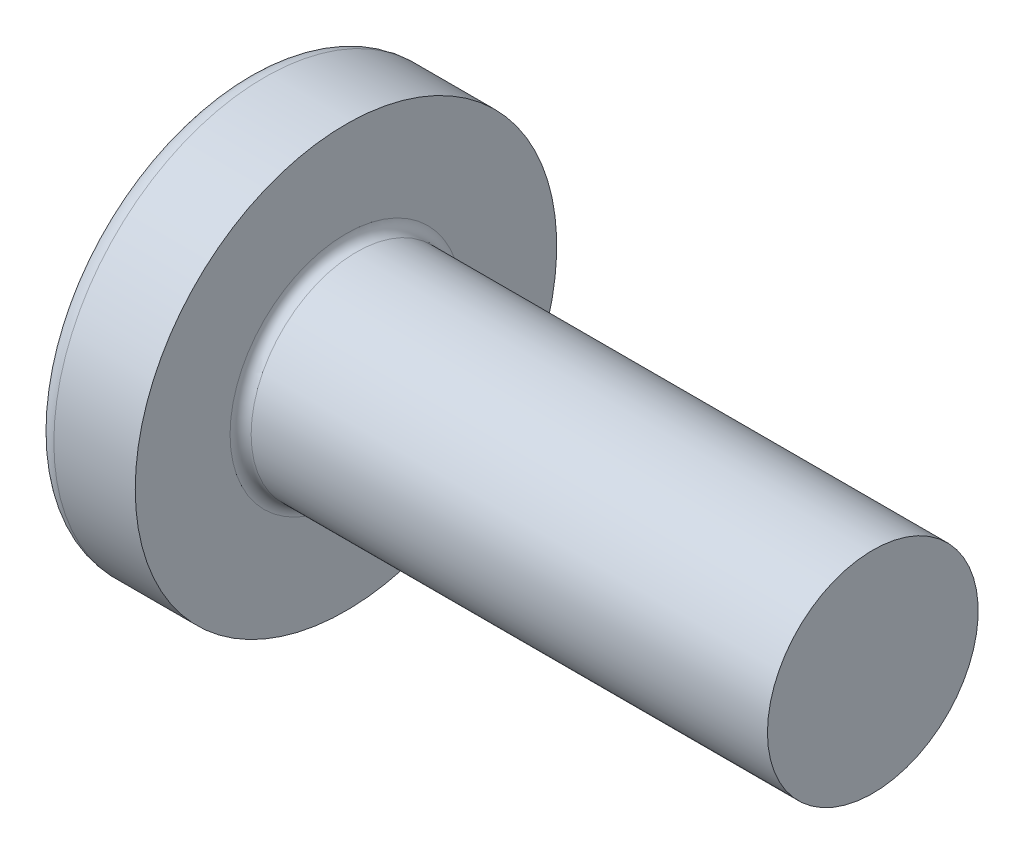
ISO-10303-21;
HEADER;
FILE_DESCRIPTION(('STEP AP214'),'2;1');
FILE_NAME('part.step','',(''),(''),'','','');
FILE_SCHEMA(('AUTOMOTIVE_DESIGN { 1 0 10303 214 1 1 1 1 }'));
ENDSEC;
DATA;
#1=APPLICATION_CONTEXT('core data for automotive mechanical design processes');
#2=APPLICATION_PROTOCOL_DEFINITION('international standard','automotive_design',2000,#1);
#3=PRODUCT_CONTEXT('',#1,'mechanical');
#4=PRODUCT('Part','Part','',(#3));
#5=PRODUCT_RELATED_PRODUCT_CATEGORY('part','',(#4));
#6=PRODUCT_DEFINITION_FORMATION('','',#4);
#7=PRODUCT_DEFINITION_CONTEXT('part definition',#1,'design');
#8=PRODUCT_DEFINITION('design','',#6,#7);
#9=PRODUCT_DEFINITION_SHAPE('','',#8);
#10=(LENGTH_UNIT() NAMED_UNIT(*) SI_UNIT(.MILLI.,.METRE.));
#11=(NAMED_UNIT(*) PLANE_ANGLE_UNIT() SI_UNIT($,.RADIAN.));
#12=(NAMED_UNIT(*) SI_UNIT($,.STERADIAN.) SOLID_ANGLE_UNIT());
#13=UNCERTAINTY_MEASURE_WITH_UNIT(LENGTH_MEASURE(1.E-05),#10,'distance_accuracy_value','');
#14=(GEOMETRIC_REPRESENTATION_CONTEXT(3) GLOBAL_UNCERTAINTY_ASSIGNED_CONTEXT((#13)) GLOBAL_UNIT_ASSIGNED_CONTEXT((#10,
#11,#12)) REPRESENTATION_CONTEXT('',''));
#15=CARTESIAN_POINT('',(0.,0.,0.));
#16=DIRECTION('',(0.,0.,1.));
#17=DIRECTION('',(1.,0.,0.));
#18=AXIS2_PLACEMENT_3D('',#15,#16,#17);
#19=CARTESIAN_POINT('',(6.5,0.,0.));
#20=DIRECTION('',(-1.,0.,0.));
#21=DIRECTION('',(0.,1.,0.));
#22=AXIS2_PLACEMENT_3D('',#19,#20,#21);
#23=SPHERICAL_SURFACE('',#22,6.5);
#24=CARTESIAN_POINT('',(1.26538895452803,0.,0.));
#25=DIRECTION('',(-1.,0.,0.));
#26=DIRECTION('',(0.,0.,1.));
#27=AXIS2_PLACEMENT_3D('',#24,#25,#26);
#28=CIRCLE('',#27,3.85342019543974);
#29=CARTESIAN_POINT('',(1.26538895452803,0.,3.85342019543974));
#30=VERTEX_POINT('',#29);
#31=EDGE_CURVE('E215',#30,#30,#28,.T.);
#32=ORIENTED_EDGE('',*,*,#31,.T.);
#33=EDGE_LOOP('',(#32));
#34=FACE_BOUND('',#33,.T.);
#35=CARTESIAN_POINT('',(0.0788099820016241,0.,0.));
#36=DIRECTION('',(1.,0.,0.));
#37=DIRECTION('',(0.,0.,-1.));
#38=AXIS2_PLACEMENT_3D('',#35,#36,#37);
#39=CIRCLE('',#38,1.0091178091571);
#40=CARTESIAN_POINT('',(0.0788099820016235,-0.514999999999997,-0.867809744562727));
#41=VERTEX_POINT('',#40);
#42=CARTESIAN_POINT('',(0.0788099820016245,-0.86780974456273,-0.515));
#43=VERTEX_POINT('',#42);
#44=EDGE_CURVE('E341',#41,#43,#39,.F.);
#45=ORIENTED_EDGE('',*,*,#44,.F.);
#46=CARTESIAN_POINT('',(6.5,-0.515,0.));
#47=DIRECTION('',(0.,1.,0.));
#48=DIRECTION('',(0.,0.,1.));
#49=AXIS2_PLACEMENT_3D('',#46,#47,#48);
#50=CIRCLE('',#49,6.47956595768575);
#51=CARTESIAN_POINT('',(0.331830520157853,-0.514999999999993,-1.98455543332603));
#52=VERTEX_POINT('',#51);
#53=EDGE_CURVE('E275',#52,#41,#50,.T.);
#54=ORIENTED_EDGE('',*,*,#53,.F.);
#55=CARTESIAN_POINT('',(6.06443225879604,0.,0.873613881878153));
#56=DIRECTION('',(0.446197753347436,0.,-0.894934391398443));
#57=DIRECTION('',(-0.894934391398442,0.,-0.446197753347436));
#58=AXIS2_PLACEMENT_3D('',#55,#56,#57);
#59=CIRCLE('',#58,6.42628038045433);
#60=CARTESIAN_POINT('',(0.331830520157854,0.515000000000007,-1.98455543332603));
#61=VERTEX_POINT('',#60);
#62=EDGE_CURVE('E249',#52,#61,#59,.T.);
#63=ORIENTED_EDGE('',*,*,#62,.T.);
#64=CARTESIAN_POINT('',(6.5,0.515000000000001,0.));
#65=DIRECTION('',(0.,-1.,0.));
#66=DIRECTION('',(0.,0.,-1.));
#67=AXIS2_PLACEMENT_3D('',#64,#65,#66);
#68=CIRCLE('',#67,6.47956595768575);
#69=CARTESIAN_POINT('',(0.0788099820016233,0.515000000000003,-0.867809744562724));
#70=VERTEX_POINT('',#69);
#71=EDGE_CURVE('E303',#70,#61,#68,.T.);
#72=ORIENTED_EDGE('',*,*,#71,.F.);
#73=CARTESIAN_POINT('',(0.0788099820016245,0.867809744562729,-0.515));
#74=VERTEX_POINT('',#73);
#75=EDGE_CURVE('E356',#74,#70,#39,.F.);
#76=ORIENTED_EDGE('',*,*,#75,.F.);
#77=CARTESIAN_POINT('',(6.5,0.,-0.515));
#78=DIRECTION('',(0.,0.,1.));
#79=DIRECTION('',(1.,0.,0.));
#80=AXIS2_PLACEMENT_3D('',#77,#78,#79);
#81=CIRCLE('',#80,6.47956595768575);
#82=CARTESIAN_POINT('',(0.331830520157854,1.98455543332603,-0.515));
#83=VERTEX_POINT('',#82);
#84=EDGE_CURVE('E243',#83,#74,#81,.T.);
#85=ORIENTED_EDGE('',*,*,#84,.F.);
#86=CARTESIAN_POINT('',(6.06443225879604,-0.873613881878153,0.));
#87=DIRECTION('',(0.446197753347436,0.894934391398443,0.));
#88=DIRECTION('',(-0.894934391398442,0.446197753347436,0.));
#89=AXIS2_PLACEMENT_3D('',#86,#87,#88);
#90=CIRCLE('',#89,6.42628038045433);
#91=CARTESIAN_POINT('',(0.331830520157854,1.98455543332603,0.515));
#92=VERTEX_POINT('',#91);
#93=EDGE_CURVE('E246',#83,#92,#90,.T.);
#94=ORIENTED_EDGE('',*,*,#93,.T.);
#95=CARTESIAN_POINT('',(6.5,0.,0.515));
#96=DIRECTION('',(0.,0.,-1.));
#97=DIRECTION('',(0.,1.,0.));
#98=AXIS2_PLACEMENT_3D('',#95,#96,#97);
#99=CIRCLE('',#98,6.47956595768575);
#100=CARTESIAN_POINT('',(0.0788099820016241,0.867809744562725,0.515));
#101=VERTEX_POINT('',#100);
#102=EDGE_CURVE('E239',#101,#92,#99,.T.);
#103=ORIENTED_EDGE('',*,*,#102,.F.);
#104=CARTESIAN_POINT('',(0.0788099820016232,0.514999999999997,0.867809744562727));
#105=VERTEX_POINT('',#104);
#106=EDGE_CURVE('E355',#105,#101,#39,.F.);
#107=ORIENTED_EDGE('',*,*,#106,.F.);
#108=CARTESIAN_POINT('',(0.331830520157854,0.514999999999993,1.98455543332604));
#109=VERTEX_POINT('',#108);
#110=EDGE_CURVE('E259',#109,#105,#68,.T.);
#111=ORIENTED_EDGE('',*,*,#110,.F.);
#112=CARTESIAN_POINT('',(6.06443225879603,0.,-0.873613881878153));
#113=DIRECTION('',(0.446197753347436,0.,0.894934391398443));
#114=DIRECTION('',(0.894934391398442,0.,-0.446197753347436));
#115=AXIS2_PLACEMENT_3D('',#112,#113,#114);
#116=CIRCLE('',#115,6.42628038045433);
#117=CARTESIAN_POINT('',(0.331830520157854,-0.515000000000007,1.98455543332603));
#118=VERTEX_POINT('',#117);
#119=EDGE_CURVE('E50',#109,#118,#116,.T.);
#120=ORIENTED_EDGE('',*,*,#119,.T.);
#121=CARTESIAN_POINT('',(0.0788099820016233,-0.515000000000003,0.867809744562724));
#122=VERTEX_POINT('',#121);
#123=EDGE_CURVE('E256',#122,#118,#50,.T.);
#124=ORIENTED_EDGE('',*,*,#123,.F.);
#125=CARTESIAN_POINT('',(0.0788099820016241,-0.867809744562726,0.514999999999999));
#126=VERTEX_POINT('',#125);
#127=EDGE_CURVE('E387',#126,#122,#39,.F.);
#128=ORIENTED_EDGE('',*,*,#127,.F.);
#129=CARTESIAN_POINT('',(0.331830520157853,-1.98455543332603,0.515));
#130=VERTEX_POINT('',#129);
#131=EDGE_CURVE('E240',#130,#126,#99,.T.);
#132=ORIENTED_EDGE('',*,*,#131,.F.);
#133=CARTESIAN_POINT('',(6.06443225879603,0.873613881878153,0.));
#134=DIRECTION('',(0.446197753347436,-0.894934391398443,0.));
#135=DIRECTION('',(0.894934391398442,0.446197753347436,0.));
#136=AXIS2_PLACEMENT_3D('',#133,#134,#135);
#137=CIRCLE('',#136,6.42628038045433);
#138=CARTESIAN_POINT('',(0.331830520157853,-1.98455543332603,-0.515));
#139=VERTEX_POINT('',#138);
#140=EDGE_CURVE('E236',#130,#139,#137,.T.);
#141=ORIENTED_EDGE('',*,*,#140,.T.);
#142=EDGE_CURVE('E65',#43,#139,#81,.T.);
#143=ORIENTED_EDGE('',*,*,#142,.F.);
#144=EDGE_LOOP('',(#45,#54,#63,#72,#76,#85,#94,#103,#107,#111,#120,#124,#128,#132,#141,#143));
#145=FACE_BOUND('',#144,.T.);
#146=ADVANCED_FACE('F37',(#34,#145),#23,.T.);
#147=CARTESIAN_POINT('',(0.,2.15,-0.515));
#148=DIRECTION('',(0.,0.,1.));
#149=DIRECTION('',(1.,0.,0.));
#150=AXIS2_PLACEMENT_3D('',#147,#148,#149);
#151=PLANE('',#150);
#152=ORIENTED_EDGE('',*,*,#84,.T.);
#153=CARTESIAN_POINT('',(-1.51195208754038,0.994972220382297,-0.515));
#154=CARTESIAN_POINT('',(-1.20405982018868,0.970722017005064,-0.515));
#155=CARTESIAN_POINT('',(-0.896180908124145,0.946299109967688,-0.515));
#156=CARTESIAN_POINT('',(-0.280449080249313,0.896981122461527,-0.515));
#157=CARTESIAN_POINT('',(0.0274038341154839,0.872086023961265,-0.515));
#158=CARTESIAN_POINT('',(0.489146739371407,0.834295535207136,-0.515));
#159=CARTESIAN_POINT('',(0.643055047497243,0.821624058408796,-0.515));
#160=CARTESIAN_POINT('',(0.950856520315202,0.796108332629705,-0.515));
#161=CARTESIAN_POINT('',(1.10474968508407,0.783264084575317,-0.515));
#162=CARTESIAN_POINT('',(1.41251352133103,0.757376569061287,-0.515));
#163=CARTESIAN_POINT('',(1.56638419343305,0.744333309025534,-0.515));
#164=CARTESIAN_POINT('',(1.87410847407519,0.718013273133716,-0.515));
#165=CARTESIAN_POINT('',(2.02796208224282,0.70473649291971,-0.515));
#166=CARTESIAN_POINT('',(2.36455311972626,0.675386942934956,-0.515));
#167=CARTESIAN_POINT('',(2.5472856237498,0.659257575568568,-0.515));
#168=CARTESIAN_POINT('',(2.91270624190895,0.626517182406014,-0.515));
#169=CARTESIAN_POINT('',(3.09539435635676,0.609906160102554,-0.515));
#170=CARTESIAN_POINT('',(3.46069832273244,0.576073027039889,-0.515));
#171=CARTESIAN_POINT('',(3.64331417951694,0.558850968855157,-0.515));
#172=CARTESIAN_POINT('',(4.00847437578178,0.523604864460044,-0.515));
#173=CARTESIAN_POINT('',(4.1910187129849,0.505580794522876,-0.515));
#174=CARTESIAN_POINT('',(4.55606208239526,0.46842919158178,-0.515));
#175=CARTESIAN_POINT('',(4.73856107439606,0.449301262195198,-0.515));
#176=CARTESIAN_POINT('',(5.10337547434977,0.409473604657435,-0.515));
#177=CARTESIAN_POINT('',(5.28569089607961,0.388774005011695,-0.515));
#178=CARTESIAN_POINT('',(5.55897278576906,0.355828287427082,-0.515));
#179=CARTESIAN_POINT('',(5.65005277501166,0.344527918680369,-0.515));
#180=CARTESIAN_POINT('',(5.83209904185046,0.3210751741555,-0.515));
#181=CARTESIAN_POINT('',(5.92306532479326,0.308922840099181,-0.515));
#182=CARTESIAN_POINT('',(6.10486078954238,0.283427334334153,-0.515));
#183=CARTESIAN_POINT('',(6.19568992380676,0.270083817479638,-0.515));
#184=CARTESIAN_POINT('',(6.33172773866873,0.248701420679479,-0.515));
#185=CARTESIAN_POINT('',(6.37704304554499,0.241345446571707,-0.515));
#186=CARTESIAN_POINT('',(6.46757225282465,0.226018953418424,-0.515));
#187=CARTESIAN_POINT('',(6.51278614649077,0.218048394719369,-0.515));
#188=CARTESIAN_POINT('',(6.55793125840465,0.209691465124902,-0.515));
#189=B_SPLINE_CURVE_WITH_KNOTS('',3,(#153,#154,#155,#156,#157,#158,#159,#160,#161,#162,#163,
#164,#165,#166,#167,#168,#169,#170,#171,#172,#173,#174,#175,#176,#177,#178,#179,#180,#181,#182,
#183,#184,#185,#186,#187,#188),.UNSPECIFIED.,.F.,.F.,(4,2,2,2,2,2,2,2,2,2,2,2,2,2,2,2,2,4),(0.,
0.926537710061278,1.85311087314258,2.31639796098494,2.77968256577269,3.24294993036838,
3.70622594962848,4.25655436226469,4.80687878520654,5.3571559716686,5.90744944841855,
6.45794177358856,7.00838913688619,7.28372117498157,7.55903973911884,7.83443833749096,
7.97216007622236,8.10989070832989),.UNSPECIFIED.);
#190=CARTESIAN_POINT('',(2.34,0.677477674908923,-0.515));
#191=VERTEX_POINT('',#190);
#192=EDGE_CURVE('E376',#74,#191,#189,.T.);
#193=ORIENTED_EDGE('',*,*,#192,.T.);
#194=DIRECTION('',(0.,1.,0.));
#195=VECTOR('',#194,1.);
#196=CARTESIAN_POINT('',(2.34,-0.983319232260742,-0.515));
#197=LINE('',#196,#195);
#198=CARTESIAN_POINT('',(2.34,0.983319232260743,-0.515));
#199=VERTEX_POINT('',#198);
#200=EDGE_CURVE('E324',#191,#199,#197,.T.);
#201=ORIENTED_EDGE('',*,*,#200,.T.);
#202=DIRECTION('',(0.894934391398442,-0.446197753347436,0.));
#203=VECTOR('',#202,1.);
#204=CARTESIAN_POINT('',(0.,2.15,-0.515));
#205=LINE('',#204,#203);
#206=EDGE_CURVE('E216',#83,#199,#205,.T.);
#207=ORIENTED_EDGE('',*,*,#206,.F.);
#208=EDGE_LOOP('',(#152,#193,#201,#207));
#209=FACE_BOUND('',#208,.T.);
#210=ADVANCED_FACE('F171',(#209),#151,.T.);
#211=CARTESIAN_POINT('',(2.34,-0.983319232260742,-0.515));
#212=VERTEX_POINT('',#211);
#213=CARTESIAN_POINT('',(2.34,-0.677477674908923,-0.515));
#214=VERTEX_POINT('',#213);
#215=EDGE_CURVE('E224',#212,#214,#197,.T.);
#216=ORIENTED_EDGE('',*,*,#215,.T.);
#217=CARTESIAN_POINT('',(-1.51195208754038,-0.994972220382297,-0.515));
#218=CARTESIAN_POINT('',(-1.20405982018868,-0.970722017005064,-0.515));
#219=CARTESIAN_POINT('',(-0.896180908124145,-0.946299109967688,-0.515));
#220=CARTESIAN_POINT('',(-0.280449080249314,-0.896981122461527,-0.515));
#221=CARTESIAN_POINT('',(0.0274038341154837,-0.872086023961265,-0.515));
#222=CARTESIAN_POINT('',(0.489146739371407,-0.834295535207136,-0.515));
#223=CARTESIAN_POINT('',(0.643055047497243,-0.821624058408796,-0.515));
#224=CARTESIAN_POINT('',(0.950856520315202,-0.796108332629705,-0.515));
#225=CARTESIAN_POINT('',(1.10474968508407,-0.783264084575317,-0.515));
#226=CARTESIAN_POINT('',(1.41251352133103,-0.757376569061287,-0.515));
#227=CARTESIAN_POINT('',(1.56638419343305,-0.744333309025534,-0.515));
#228=CARTESIAN_POINT('',(1.87410847407519,-0.718013273133716,-0.515));
#229=CARTESIAN_POINT('',(2.02796208224282,-0.70473649291971,-0.515));
#230=CARTESIAN_POINT('',(2.36455311972626,-0.675386942934956,-0.515));
#231=CARTESIAN_POINT('',(2.5472856237498,-0.659257575568568,-0.515));
#232=CARTESIAN_POINT('',(2.91270624190895,-0.626517182406014,-0.515));
#233=CARTESIAN_POINT('',(3.09539435635676,-0.609906160102554,-0.515));
#234=CARTESIAN_POINT('',(3.46069832273244,-0.576073027039889,-0.515));
#235=CARTESIAN_POINT('',(3.64331417951694,-0.558850968855156,-0.515));
#236=CARTESIAN_POINT('',(4.00847437578178,-0.523604864460044,-0.515));
#237=CARTESIAN_POINT('',(4.1910187129849,-0.505580794522876,-0.515));
#238=CARTESIAN_POINT('',(4.55606208239526,-0.46842919158178,-0.515));
#239=CARTESIAN_POINT('',(4.73856107439606,-0.449301262195198,-0.515));
#240=CARTESIAN_POINT('',(5.10337547434977,-0.409473604657435,-0.515));
#241=CARTESIAN_POINT('',(5.28569089607961,-0.388774005011695,-0.515));
#242=CARTESIAN_POINT('',(5.55897278576906,-0.355828287427082,-0.515));
#243=CARTESIAN_POINT('',(5.65005277501166,-0.344527918680369,-0.515));
#244=CARTESIAN_POINT('',(5.83209904185046,-0.3210751741555,-0.515));
#245=CARTESIAN_POINT('',(5.92306532479326,-0.308922840099181,-0.515));
#246=CARTESIAN_POINT('',(6.10486078954238,-0.283427334334152,-0.515));
#247=CARTESIAN_POINT('',(6.19568992380676,-0.270083817479637,-0.515));
#248=CARTESIAN_POINT('',(6.33172773866873,-0.248701420679479,-0.515));
#249=CARTESIAN_POINT('',(6.377043045545,-0.241345446571707,-0.515));
#250=CARTESIAN_POINT('',(6.46757225282465,-0.226018953418423,-0.515));
#251=CARTESIAN_POINT('',(6.51278614649077,-0.218048394719369,-0.515));
#252=CARTESIAN_POINT('',(6.55793125840465,-0.209691465124902,-0.515));
#253=B_SPLINE_CURVE_WITH_KNOTS('',3,(#217,#218,#219,#220,#221,#222,#223,#224,#225,#226,#227,
#228,#229,#230,#231,#232,#233,#234,#235,#236,#237,#238,#239,#240,#241,#242,#243,#244,#245,#246,
#247,#248,#249,#250,#251,#252),.UNSPECIFIED.,.F.,.F.,(4,2,2,2,2,2,2,2,2,2,2,2,2,2,2,2,2,4),(0.,
0.926537710061278,1.85311087314258,2.31639796098494,2.77968256577269,3.24294993036838,
3.70622594962848,4.2565543622647,4.80687878520654,5.3571559716686,5.90744944841855,
6.45794177358856,7.00838913688619,7.28372117498157,7.55903973911884,7.83443833749096,
7.97216007622236,8.10989070832989),.UNSPECIFIED.);
#254=EDGE_CURVE('E354',#214,#43,#253,.F.);
#255=ORIENTED_EDGE('',*,*,#254,.T.);
#256=ORIENTED_EDGE('',*,*,#142,.T.);
#257=DIRECTION('',(0.894934391398442,0.446197753347436,0.));
#258=VECTOR('',#257,1.);
#259=CARTESIAN_POINT('',(0.,-2.15,-0.515));
#260=LINE('',#259,#258);
#261=EDGE_CURVE('E306',#139,#212,#260,.T.);
#262=ORIENTED_EDGE('',*,*,#261,.T.);
#263=EDGE_LOOP('',(#216,#255,#256,#262));
#264=FACE_BOUND('',#263,.T.);
#265=ADVANCED_FACE('F177',(#264),#151,.T.);
#266=CARTESIAN_POINT('',(0.,-2.15,0.514999999999999));
#267=DIRECTION('',(0.,0.,-1.));
#268=DIRECTION('',(0.,1.,0.));
#269=AXIS2_PLACEMENT_3D('',#266,#267,#268);
#270=PLANE('',#269);
#271=DIRECTION('',(0.,-1.,0.));
#272=VECTOR('',#271,1.);
#273=CARTESIAN_POINT('',(2.34,0.983319232260742,0.515));
#274=LINE('',#273,#272);
#275=CARTESIAN_POINT('',(2.34,0.983319232260743,0.515));
#276=VERTEX_POINT('',#275);
#277=CARTESIAN_POINT('',(2.34,0.677477674908923,0.515));
#278=VERTEX_POINT('',#277);
#279=EDGE_CURVE('E314',#276,#278,#274,.T.);
#280=ORIENTED_EDGE('',*,*,#279,.T.);
#281=CARTESIAN_POINT('',(-1.51195208754037,0.994972220382297,0.515));
#282=CARTESIAN_POINT('',(-1.20405982018868,0.970722017005064,0.515));
#283=CARTESIAN_POINT('',(-0.896180908124145,0.946299109967689,0.515));
#284=CARTESIAN_POINT('',(-0.280449080249313,0.896981122461527,0.515));
#285=CARTESIAN_POINT('',(0.0274038341154838,0.872086023961265,0.515));
#286=CARTESIAN_POINT('',(0.489146739371407,0.834295535207136,0.515));
#287=CARTESIAN_POINT('',(0.643055047497244,0.821624058408796,0.515));
#288=CARTESIAN_POINT('',(0.950856520315202,0.796108332629705,0.515));
#289=CARTESIAN_POINT('',(1.10474968508407,0.783264084575317,0.515));
#290=CARTESIAN_POINT('',(1.41251352133103,0.757376569061287,0.515));
#291=CARTESIAN_POINT('',(1.56638419343305,0.744333309025534,0.515));
#292=CARTESIAN_POINT('',(1.87410847407519,0.718013273133716,0.515));
#293=CARTESIAN_POINT('',(2.02796208224282,0.70473649291971,0.515));
#294=CARTESIAN_POINT('',(2.36455311972626,0.675386942934956,0.515));
#295=CARTESIAN_POINT('',(2.5472856237498,0.659257575568568,0.515));
#296=CARTESIAN_POINT('',(2.91270624190895,0.626517182406014,0.515));
#297=CARTESIAN_POINT('',(3.09539435635676,0.609906160102555,0.515));
#298=CARTESIAN_POINT('',(3.46069832273244,0.576073027039889,0.515));
#299=CARTESIAN_POINT('',(3.64331417951694,0.558850968855157,0.515));
#300=CARTESIAN_POINT('',(4.00847437578178,0.523604864460044,0.515));
#301=CARTESIAN_POINT('',(4.1910187129849,0.505580794522876,0.515));
#302=CARTESIAN_POINT('',(4.55606208239526,0.46842919158178,0.515));
#303=CARTESIAN_POINT('',(4.73856107439606,0.449301262195198,0.515));
#304=CARTESIAN_POINT('',(5.10337547434977,0.409473604657435,0.515));
#305=CARTESIAN_POINT('',(5.28569089607961,0.388774005011695,0.515));
#306=CARTESIAN_POINT('',(5.55897278576906,0.355828287427082,0.515));
#307=CARTESIAN_POINT('',(5.65005277501166,0.344527918680369,0.515));
#308=CARTESIAN_POINT('',(5.83209904185046,0.3210751741555,0.515));
#309=CARTESIAN_POINT('',(5.92306532479326,0.308922840099181,0.515));
#310=CARTESIAN_POINT('',(6.10486078954238,0.283427334334153,0.515));
#311=CARTESIAN_POINT('',(6.19568992380676,0.270083817479637,0.515));
#312=CARTESIAN_POINT('',(6.33172773866874,0.248701420679479,0.515));
#313=CARTESIAN_POINT('',(6.377043045545,0.241345446571707,0.515));
#314=CARTESIAN_POINT('',(6.46757225282465,0.226018953418424,0.515));
#315=CARTESIAN_POINT('',(6.51278614649077,0.218048394719369,0.515));
#316=CARTESIAN_POINT('',(6.55793125840465,0.209691465124902,0.515));
#317=B_SPLINE_CURVE_WITH_KNOTS('',3,(#281,#282,#283,#284,#285,#286,#287,#288,#289,#290,#291,
#292,#293,#294,#295,#296,#297,#298,#299,#300,#301,#302,#303,#304,#305,#306,#307,#308,#309,#310,
#311,#312,#313,#314,#315,#316),.UNSPECIFIED.,.F.,.F.,(4,2,2,2,2,2,2,2,2,2,2,2,2,2,2,2,2,4),(0.,
0.926537710061278,1.85311087314258,2.31639796098494,2.77968256577269,3.24294993036838,
3.70622594962848,4.25655436226469,4.80687878520654,5.3571559716686,5.90744944841855,
6.45794177358856,7.00838913688619,7.28372117498157,7.55903973911884,7.83443833749096,
7.97216007622236,8.10989070832989),.UNSPECIFIED.);
#318=EDGE_CURVE('E280',#278,#101,#317,.F.);
#319=ORIENTED_EDGE('',*,*,#318,.T.);
#320=ORIENTED_EDGE('',*,*,#102,.T.);
#321=DIRECTION('',(0.894934391398442,-0.446197753347436,0.));
#322=VECTOR('',#321,1.);
#323=CARTESIAN_POINT('',(0.,2.15,0.515));
#324=LINE('',#323,#322);
#325=EDGE_CURVE('E221',#92,#276,#324,.T.);
#326=ORIENTED_EDGE('',*,*,#325,.T.);
#327=EDGE_LOOP('',(#280,#319,#320,#326));
#328=FACE_BOUND('',#327,.T.);
#329=ADVANCED_FACE('F372',(#328),#270,.T.);
#330=ORIENTED_EDGE('',*,*,#131,.T.);
#331=CARTESIAN_POINT('',(-1.51195208675156,-0.994972220320187,0.514999999999999));
#332=CARTESIAN_POINT('',(-1.2040598194928,-0.970722016949958,0.514999999999999));
#333=CARTESIAN_POINT('',(-0.896180907521175,-0.946299109919651,0.514999999999999));
#334=CARTESIAN_POINT('',(-0.280449079832187,-0.896981122427852,0.514999999999999));
#335=CARTESIAN_POINT('',(0.0274038344396858,-0.872086023934883,0.514999999999999));
#336=CARTESIAN_POINT('',(0.489146739515349,-0.83429553519528,0.515));
#337=CARTESIAN_POINT('',(0.643055047553845,-0.821624058404092,0.515));
#338=CARTESIAN_POINT('',(0.950856520197139,-0.796108332639504,0.515));
#339=CARTESIAN_POINT('',(1.10474968487868,-0.783264084592466,0.515));
#340=CARTESIAN_POINT('',(1.41251352095103,-0.757376569093379,0.515));
#341=CARTESIAN_POINT('',(1.56638419296577,-0.744333309065218,0.515));
#342=CARTESIAN_POINT('',(1.87410847343335,-0.718013273188896,0.515));
#343=CARTESIAN_POINT('',(2.02796208151372,-0.704736492982792,0.515));
#344=CARTESIAN_POINT('',(2.36455311890988,-0.675386943006727,0.515));
#345=CARTESIAN_POINT('',(2.54728562293341,-0.659257575640986,0.515));
#346=CARTESIAN_POINT('',(2.91270624109255,-0.626517182479888,0.515));
#347=CARTESIAN_POINT('',(3.09539435554037,-0.609906160177238,0.515));
#348=CARTESIAN_POINT('',(3.46069832191612,-0.576073027116422,0.515));
#349=CARTESIAN_POINT('',(3.64331417870068,-0.558850968932728,0.515));
#350=CARTESIAN_POINT('',(4.00847437496567,-0.523604864540038,0.515));
#351=CARTESIAN_POINT('',(4.19101871216888,-0.505580794604253,0.515));
#352=CARTESIAN_POINT('',(4.55606208157937,-0.468429191666488,0.515));
#353=CARTESIAN_POINT('',(4.73856107358022,-0.449301262281854,0.515));
#354=CARTESIAN_POINT('',(5.10337547353418,-0.409473604748925,0.515));
#355=CARTESIAN_POINT('',(5.28569089526422,-0.38877400510607,0.515));
#356=CARTESIAN_POINT('',(5.55897278495412,-0.355828287527265,0.515));
#357=CARTESIAN_POINT('',(5.65005277419686,-0.344527918782739,0.515));
#358=CARTESIAN_POINT('',(5.83209904103607,-0.321075174263031,0.515));
#359=CARTESIAN_POINT('',(5.92306532397915,-0.308922840209686,0.515));
#360=CARTESIAN_POINT('',(6.10486078872898,-0.283427334451931,0.515));
#361=CARTESIAN_POINT('',(6.19568992299379,-0.270083817601715,0.515));
#362=CARTESIAN_POINT('',(6.33172773785679,-0.248701420809951,0.515));
#363=CARTESIAN_POINT('',(6.37704304473344,-0.241345446705304,0.515));
#364=CARTESIAN_POINT('',(6.4675722520141,-0.226018953559338,0.515));
#365=CARTESIAN_POINT('',(6.51278614568083,-0.218048394864476,0.515));
#366=CARTESIAN_POINT('',(6.55793125759549,-0.209691465274945,0.515));
#367=B_SPLINE_CURVE_WITH_KNOTS('',3,(#331,#332,#333,#334,#335,#336,#337,#338,#339,#340,#341,
#342,#343,#344,#345,#346,#347,#348,#349,#350,#351,#352,#353,#354,#355,#356,#357,#358,#359,#360,
#361,#362,#363,#364,#365,#366),.UNSPECIFIED.,.F.,.F.,(4,2,2,2,2,2,2,2,2,2,2,2,2,2,2,2,2,4),(0.,
0.92653770978172,1.85311087258339,2.31639796016285,2.77968256468771,3.24294992902054,
3.70622594801777,4.25655436065378,4.80687878359543,5.35715597005738,5.90744944680718,
6.45794177197673,7.008389135274,7.28372117336898,7.55903973750591,7.83443833587748,
7.97216007460855,8.10989070671571),.UNSPECIFIED.);
#368=CARTESIAN_POINT('',(2.34,-0.677477674908923,0.515));
#369=VERTEX_POINT('',#368);
#370=EDGE_CURVE('E388',#126,#369,#367,.T.);
#371=ORIENTED_EDGE('',*,*,#370,.T.);
#372=CARTESIAN_POINT('',(2.34,-0.983319232260743,0.515));
#373=VERTEX_POINT('',#372);
#374=EDGE_CURVE('E316',#369,#373,#274,.T.);
#375=ORIENTED_EDGE('',*,*,#374,.T.);
#376=DIRECTION('',(0.894934391398443,0.446197753347436,0.));
#377=VECTOR('',#376,1.);
#378=CARTESIAN_POINT('',(0.,-2.15,0.514999999999999));
#379=LINE('',#378,#377);
#380=EDGE_CURVE('E308',#130,#373,#379,.T.);
#381=ORIENTED_EDGE('',*,*,#380,.F.);
#382=EDGE_LOOP('',(#330,#371,#375,#381));
#383=FACE_BOUND('',#382,.T.);
#384=ADVANCED_FACE('F417',(#383),#270,.T.);
#385=CARTESIAN_POINT('',(2.34,0.983319232260742,-0.515));
#386=DIRECTION('',(-1.,0.,0.));
#387=DIRECTION('',(0.,0.,1.));
#388=AXIS2_PLACEMENT_3D('',#385,#386,#387);
#389=PLANE('',#388);
#390=ORIENTED_EDGE('',*,*,#374,.F.);
#391=CARTESIAN_POINT('',(2.34,0.,0.));
#392=DIRECTION('',(-1.,0.,0.));
#393=DIRECTION('',(0.,0.,1.));
#394=AXIS2_PLACEMENT_3D('',#391,#392,#393);
#395=CIRCLE('',#394,0.851);
#396=EDGE_CURVE('E349',#214,#369,#395,.T.);
#397=ORIENTED_EDGE('',*,*,#396,.F.);
#398=ORIENTED_EDGE('',*,*,#215,.F.);
#399=DIRECTION('',(0.,0.,1.));
#400=VECTOR('',#399,1.);
#401=CARTESIAN_POINT('',(2.34,-0.983319232260742,-0.515));
#402=LINE('',#401,#400);
#403=EDGE_CURVE('E311',#212,#373,#402,.T.);
#404=ORIENTED_EDGE('',*,*,#403,.T.);
#405=EDGE_LOOP('',(#390,#397,#398,#404));
#406=FACE_BOUND('',#405,.T.);
#407=ADVANCED_FACE('F410',(#406),#389,.T.);
#408=DIRECTION('',(0.,0.,-1.));
#409=VECTOR('',#408,1.);
#410=CARTESIAN_POINT('',(2.34,-0.515000000000004,0.983319232260741));
#411=LINE('',#410,#409);
#412=CARTESIAN_POINT('',(2.34,-0.514999999999997,-0.677477674908925));
#413=VERTEX_POINT('',#412);
#414=CARTESIAN_POINT('',(2.34,-0.514999999999996,-0.983319232260744));
#415=VERTEX_POINT('',#414);
#416=EDGE_CURVE('E297',#413,#415,#411,.T.);
#417=ORIENTED_EDGE('',*,*,#416,.F.);
#418=CARTESIAN_POINT('',(2.34,0.515000000000003,-0.677477674908921));
#419=VERTEX_POINT('',#418);
#420=EDGE_CURVE('E57',#419,#413,#395,.T.);
#421=ORIENTED_EDGE('',*,*,#420,.F.);
#422=DIRECTION('',(0.,0.,1.));
#423=VECTOR('',#422,1.);
#424=CARTESIAN_POINT('',(2.34,0.515000000000004,-0.983319232260741));
#425=LINE('',#424,#423);
#426=CARTESIAN_POINT('',(2.34,0.515000000000004,-0.983319232260741));
#427=VERTEX_POINT('',#426);
#428=EDGE_CURVE('E300',#427,#419,#425,.T.);
#429=ORIENTED_EDGE('',*,*,#428,.F.);
#430=DIRECTION('',(0.,-1.,0.));
#431=VECTOR('',#430,1.);
#432=CARTESIAN_POINT('',(2.34,0.515000000000004,-0.983319232260741));
#433=LINE('',#432,#431);
#434=EDGE_CURVE('E291',#427,#415,#433,.T.);
#435=ORIENTED_EDGE('',*,*,#434,.T.);
#436=EDGE_LOOP('',(#417,#421,#429,#435));
#437=FACE_BOUND('',#436,.T.);
#438=ADVANCED_FACE('F344',(#437),#389,.T.);
#439=ORIENTED_EDGE('',*,*,#200,.F.);
#440=EDGE_CURVE('E348',#278,#191,#395,.T.);
#441=ORIENTED_EDGE('',*,*,#440,.F.);
#442=ORIENTED_EDGE('',*,*,#279,.F.);
#443=DIRECTION('',(0.,0.,-1.));
#444=VECTOR('',#443,1.);
#445=CARTESIAN_POINT('',(2.34,0.983319232260742,0.515));
#446=LINE('',#445,#444);
#447=EDGE_CURVE('E317',#276,#199,#446,.T.);
#448=ORIENTED_EDGE('',*,*,#447,.T.);
#449=EDGE_LOOP('',(#439,#441,#442,#448));
#450=FACE_BOUND('',#449,.T.);
#451=ADVANCED_FACE('F411',(#450),#389,.T.);
#452=CARTESIAN_POINT('',(0.,0.514999999999992,2.15));
#453=DIRECTION('',(0.,-1.,0.));
#454=DIRECTION('',(1.,0.,0.));
#455=AXIS2_PLACEMENT_3D('',#452,#453,#454);
#456=PLANE('',#455);
#457=ORIENTED_EDGE('',*,*,#110,.T.);
#458=CARTESIAN_POINT('',(-1.51195208754038,0.514999999999996,0.994972220382299));
#459=CARTESIAN_POINT('',(-1.20405982018868,0.514999999999996,0.970722017005065));
#460=CARTESIAN_POINT('',(-0.896180908124144,0.514999999999996,0.94629910996769));
#461=CARTESIAN_POINT('',(-0.280449080249313,0.514999999999997,0.896981122461529));
#462=CARTESIAN_POINT('',(0.0274038341154841,0.514999999999997,0.872086023961266));
#463=CARTESIAN_POINT('',(0.489146739371407,0.514999999999997,0.834295535207138));
#464=CARTESIAN_POINT('',(0.643055047497244,0.514999999999997,0.821624058408798));
#465=CARTESIAN_POINT('',(0.950856520315202,0.514999999999997,0.796108332629707));
#466=CARTESIAN_POINT('',(1.10474968508407,0.514999999999997,0.783264084575319));
#467=CARTESIAN_POINT('',(1.41251352133103,0.514999999999998,0.757376569061289));
#468=CARTESIAN_POINT('',(1.56638419343305,0.514999999999998,0.744333309025535));
#469=CARTESIAN_POINT('',(1.87410847407519,0.514999999999998,0.718013273133717));
#470=CARTESIAN_POINT('',(2.02796208224282,0.514999999999998,0.704736492919711));
#471=CARTESIAN_POINT('',(2.36455311972626,0.514999999999998,0.675386942934957));
#472=CARTESIAN_POINT('',(2.5472856237498,0.514999999999998,0.65925757556857));
#473=CARTESIAN_POINT('',(2.91270624190895,0.514999999999998,0.626517182406015));
#474=CARTESIAN_POINT('',(3.09539435635676,0.514999999999998,0.609906160102556));
#475=CARTESIAN_POINT('',(3.46069832273244,0.514999999999998,0.576073027039891));
#476=CARTESIAN_POINT('',(3.64331417951694,0.514999999999998,0.558850968855158));
#477=CARTESIAN_POINT('',(4.00847437578178,0.514999999999999,0.523604864460045));
#478=CARTESIAN_POINT('',(4.1910187129849,0.514999999999999,0.505580794522877));
#479=CARTESIAN_POINT('',(4.55606208239526,0.514999999999999,0.468429191581781));
#480=CARTESIAN_POINT('',(4.73856107439606,0.514999999999999,0.449301262195199));
#481=CARTESIAN_POINT('',(5.10337547434977,0.514999999999999,0.409473604657437));
#482=CARTESIAN_POINT('',(5.28569089607961,0.514999999999999,0.388774005011697));
#483=CARTESIAN_POINT('',(5.55897278576906,0.514999999999999,0.355828287427084));
#484=CARTESIAN_POINT('',(5.65005277501166,0.514999999999999,0.344527918680371));
#485=CARTESIAN_POINT('',(5.83209904185046,0.514999999999999,0.321075174155502));
#486=CARTESIAN_POINT('',(5.92306532479326,0.514999999999999,0.308922840099183));
#487=CARTESIAN_POINT('',(6.10486078954238,0.514999999999999,0.283427334334155));
#488=CARTESIAN_POINT('',(6.19568992380676,0.514999999999999,0.270083817479639));
#489=CARTESIAN_POINT('',(6.33172773866873,0.515,0.248701420679481));
#490=CARTESIAN_POINT('',(6.37704304554499,0.515,0.241345446571709));
#491=CARTESIAN_POINT('',(6.46757225282465,0.515,0.226018953418425));
#492=CARTESIAN_POINT('',(6.51278614649077,0.515,0.218048394719371));
#493=CARTESIAN_POINT('',(6.55793125840465,0.515,0.209691465124904));
#494=B_SPLINE_CURVE_WITH_KNOTS('',3,(#458,#459,#460,#461,#462,#463,#464,#465,#466,#467,#468,
#469,#470,#471,#472,#473,#474,#475,#476,#477,#478,#479,#480,#481,#482,#483,#484,#485,#486,#487,
#488,#489,#490,#491,#492,#493),.UNSPECIFIED.,.F.,.F.,(4,2,2,2,2,2,2,2,2,2,2,2,2,2,2,2,2,4),(0.,
0.926537710061279,1.85311087314258,2.31639796098494,2.77968256577269,3.24294993036838,
3.70622594962848,4.2565543622647,4.80687878520654,5.3571559716686,5.90744944841855,
6.45794177358856,7.00838913688619,7.28372117498157,7.55903973911884,7.83443833749096,
7.97216007622235,8.10989070832989),.UNSPECIFIED.);
#495=CARTESIAN_POINT('',(2.34,0.514999999999998,0.677477674908924));
#496=VERTEX_POINT('',#495);
#497=EDGE_CURVE('E435',#105,#496,#494,.T.);
#498=ORIENTED_EDGE('',*,*,#497,.T.);
#499=CARTESIAN_POINT('',(2.34,0.514999999999997,0.983319232260744));
#500=VERTEX_POINT('',#499);
#501=EDGE_CURVE('E273',#496,#500,#425,.T.);
#502=ORIENTED_EDGE('',*,*,#501,.T.);
#503=DIRECTION('',(0.894934391398442,0.,-0.446197753347436));
#504=VECTOR('',#503,1.);
#505=CARTESIAN_POINT('',(0.,0.514999999999992,2.15));
#506=LINE('',#505,#504);
#507=EDGE_CURVE('E266',#109,#500,#506,.T.);
#508=ORIENTED_EDGE('',*,*,#507,.F.);
#509=EDGE_LOOP('',(#457,#498,#502,#508));
#510=FACE_BOUND('',#509,.T.);
#511=ADVANCED_FACE('F270',(#510),#456,.T.);
#512=CARTESIAN_POINT('',(0.,-0.514999999999992,-2.15));
#513=DIRECTION('',(0.,1.,0.));
#514=DIRECTION('',(0.,0.,1.));
#515=AXIS2_PLACEMENT_3D('',#512,#513,#514);
#516=PLANE('',#515);
#517=CARTESIAN_POINT('',(2.34,-0.515000000000004,0.983319232260741));
#518=VERTEX_POINT('',#517);
#519=CARTESIAN_POINT('',(2.34,-0.515000000000002,0.677477674908921));
#520=VERTEX_POINT('',#519);
#521=EDGE_CURVE('E294',#518,#520,#411,.T.);
#522=ORIENTED_EDGE('',*,*,#521,.T.);
#523=CARTESIAN_POINT('',(-1.51195208675156,-0.515000000000003,0.994972220320186));
#524=CARTESIAN_POINT('',(-1.2040598194928,-0.515000000000003,0.970722016949956));
#525=CARTESIAN_POINT('',(-0.896180907521175,-0.515000000000003,0.946299109919649));
#526=CARTESIAN_POINT('',(-0.280449079832187,-0.515000000000003,0.89698112242785));
#527=CARTESIAN_POINT('',(0.0274038344396857,-0.515000000000003,0.872086023934881));
#528=CARTESIAN_POINT('',(0.489146739515349,-0.515000000000003,0.834295535195278));
#529=CARTESIAN_POINT('',(0.643055047553845,-0.515000000000003,0.82162405840409));
#530=CARTESIAN_POINT('',(0.950856520197139,-0.515000000000003,0.796108332639502));
#531=CARTESIAN_POINT('',(1.10474968487868,-0.515000000000003,0.783264084592464));
#532=CARTESIAN_POINT('',(1.41251352095103,-0.515000000000003,0.757376569093377));
#533=CARTESIAN_POINT('',(1.56638419296577,-0.515000000000003,0.744333309065216));
#534=CARTESIAN_POINT('',(1.87410847343335,-0.515000000000003,0.718013273188894));
#535=CARTESIAN_POINT('',(2.02796208151372,-0.515000000000003,0.70473649298279));
#536=CARTESIAN_POINT('',(2.36455311890989,-0.515000000000003,0.675386943006725));
#537=CARTESIAN_POINT('',(2.54728562293342,-0.515000000000003,0.659257575640984));
#538=CARTESIAN_POINT('',(2.91270624109256,-0.515000000000002,0.626517182479886));
#539=CARTESIAN_POINT('',(3.09539435554038,-0.515000000000002,0.609906160177236));
#540=CARTESIAN_POINT('',(3.46069832191612,-0.515000000000002,0.57607302711642));
#541=CARTESIAN_POINT('',(3.64331417870068,-0.515000000000002,0.558850968932725));
#542=CARTESIAN_POINT('',(4.00847437496567,-0.515000000000002,0.523604864540036));
#543=CARTESIAN_POINT('',(4.19101871216888,-0.515000000000002,0.505580794604251));
#544=CARTESIAN_POINT('',(4.55606208157937,-0.515000000000002,0.468429191666486));
#545=CARTESIAN_POINT('',(4.73856107358022,-0.515000000000002,0.449301262281852));
#546=CARTESIAN_POINT('',(5.10337547353418,-0.515000000000002,0.409473604748923));
#547=CARTESIAN_POINT('',(5.28569089526422,-0.515000000000002,0.388774005106068));
#548=CARTESIAN_POINT('',(5.55897278495412,-0.515000000000002,0.355828287527262));
#549=CARTESIAN_POINT('',(5.65005277419686,-0.515000000000002,0.344527918782737));
#550=CARTESIAN_POINT('',(5.83209904103607,-0.515000000000002,0.321075174263029));
#551=CARTESIAN_POINT('',(5.92306532397915,-0.515000000000001,0.308922840209684));
#552=CARTESIAN_POINT('',(6.10486078872898,-0.515000000000001,0.283427334451928));
#553=CARTESIAN_POINT('',(6.19568992299379,-0.515000000000001,0.270083817601712));
#554=CARTESIAN_POINT('',(6.33172773785679,-0.515000000000001,0.248701420809949));
#555=CARTESIAN_POINT('',(6.37704304473344,-0.515000000000001,0.241345446705302));
#556=CARTESIAN_POINT('',(6.4675722520141,-0.515000000000001,0.226018953559336));
#557=CARTESIAN_POINT('',(6.51278614568083,-0.515000000000001,0.218048394864474));
#558=CARTESIAN_POINT('',(6.55793125759549,-0.515000000000001,0.209691465274943));
#559=B_SPLINE_CURVE_WITH_KNOTS('',3,(#523,#524,#525,#526,#527,#528,#529,#530,#531,#532,#533,
#534,#535,#536,#537,#538,#539,#540,#541,#542,#543,#544,#545,#546,#547,#548,#549,#550,#551,#552,
#553,#554,#555,#556,#557,#558),.UNSPECIFIED.,.F.,.F.,(4,2,2,2,2,2,2,2,2,2,2,2,2,2,2,2,2,4),(0.,
0.92653770978172,1.85311087258339,2.31639796016285,2.77968256468771,3.24294992902054,
3.70622594801777,4.25655436065378,4.80687878359543,5.35715597005738,5.90744944680718,
6.45794177197673,7.008389135274,7.28372117336899,7.55903973750591,7.83443833587749,
7.97216007460855,8.10989070671571),.UNSPECIFIED.);
#560=EDGE_CURVE('E381',#520,#122,#559,.F.);
#561=ORIENTED_EDGE('',*,*,#560,.T.);
#562=ORIENTED_EDGE('',*,*,#123,.T.);
#563=DIRECTION('',(0.894934391398442,0.,-0.446197753347436));
#564=VECTOR('',#563,1.);
#565=CARTESIAN_POINT('',(0.,-0.515000000000008,2.15));
#566=LINE('',#565,#564);
#567=EDGE_CURVE('E268',#118,#518,#566,.T.);
#568=ORIENTED_EDGE('',*,*,#567,.T.);
#569=EDGE_LOOP('',(#522,#561,#562,#568));
#570=FACE_BOUND('',#569,.T.);
#571=ADVANCED_FACE('F206',(#570),#516,.T.);
#572=ORIENTED_EDGE('',*,*,#428,.T.);
#573=CARTESIAN_POINT('',(-1.51195208675156,0.515000000000003,-0.994972220320186));
#574=CARTESIAN_POINT('',(-1.2040598194928,0.515000000000003,-0.970722016949956));
#575=CARTESIAN_POINT('',(-0.896180907521175,0.515000000000003,-0.946299109919649));
#576=CARTESIAN_POINT('',(-0.280449079832187,0.515000000000003,-0.896981122427849));
#577=CARTESIAN_POINT('',(0.0274038344396857,0.515000000000003,-0.872086023934881));
#578=CARTESIAN_POINT('',(0.489146739515349,0.515000000000003,-0.834295535195278));
#579=CARTESIAN_POINT('',(0.643055047553845,0.515000000000003,-0.82162405840409));
#580=CARTESIAN_POINT('',(0.950856520197139,0.515000000000003,-0.796108332639502));
#581=CARTESIAN_POINT('',(1.10474968487868,0.515000000000003,-0.783264084592463));
#582=CARTESIAN_POINT('',(1.41251352095103,0.515000000000003,-0.757376569093376));
#583=CARTESIAN_POINT('',(1.56638419296577,0.515000000000003,-0.744333309065216));
#584=CARTESIAN_POINT('',(1.87410847343335,0.515000000000003,-0.718013273188894));
#585=CARTESIAN_POINT('',(2.02796208151372,0.515000000000003,-0.70473649298279));
#586=CARTESIAN_POINT('',(2.36455311890989,0.515000000000003,-0.675386943006724));
#587=CARTESIAN_POINT('',(2.54728562293342,0.515000000000003,-0.659257575640984));
#588=CARTESIAN_POINT('',(2.91270624109256,0.515000000000002,-0.626517182479886));
#589=CARTESIAN_POINT('',(3.09539435554038,0.515000000000002,-0.609906160177236));
#590=CARTESIAN_POINT('',(3.46069832191612,0.515000000000002,-0.576073027116419));
#591=CARTESIAN_POINT('',(3.64331417870068,0.515000000000002,-0.558850968932725));
#592=CARTESIAN_POINT('',(4.00847437496567,0.515000000000002,-0.523604864540035));
#593=CARTESIAN_POINT('',(4.19101871216888,0.515000000000002,-0.505580794604251));
#594=CARTESIAN_POINT('',(4.55606208157937,0.515000000000002,-0.468429191666486));
#595=CARTESIAN_POINT('',(4.73856107358022,0.515000000000002,-0.449301262281852));
#596=CARTESIAN_POINT('',(5.10337547353418,0.515000000000002,-0.409473604748922));
#597=CARTESIAN_POINT('',(5.28569089526422,0.515000000000002,-0.388774005106068));
#598=CARTESIAN_POINT('',(5.55897278495412,0.515000000000002,-0.355828287527262));
#599=CARTESIAN_POINT('',(5.65005277419686,0.515000000000002,-0.344527918782736));
#600=CARTESIAN_POINT('',(5.83209904103608,0.515000000000002,-0.321075174263029));
#601=CARTESIAN_POINT('',(5.92306532397915,0.515000000000002,-0.308922840209684));
#602=CARTESIAN_POINT('',(6.10486078872898,0.515000000000002,-0.283427334451928));
#603=CARTESIAN_POINT('',(6.1956899229938,0.515000000000002,-0.270083817601712));
#604=CARTESIAN_POINT('',(6.33172773785679,0.515000000000001,-0.248701420809949));
#605=CARTESIAN_POINT('',(6.37704304473344,0.515000000000001,-0.241345446705302));
#606=CARTESIAN_POINT('',(6.4675722520141,0.515000000000001,-0.226018953559336));
#607=CARTESIAN_POINT('',(6.51278614568083,0.515000000000001,-0.218048394864474));
#608=CARTESIAN_POINT('',(6.55793125759549,0.515000000000001,-0.209691465274942));
#609=B_SPLINE_CURVE_WITH_KNOTS('',3,(#573,#574,#575,#576,#577,#578,#579,#580,#581,#582,#583,
#584,#585,#586,#587,#588,#589,#590,#591,#592,#593,#594,#595,#596,#597,#598,#599,#600,#601,#602,
#603,#604,#605,#606,#607,#608),.UNSPECIFIED.,.F.,.F.,(4,2,2,2,2,2,2,2,2,2,2,2,2,2,2,2,2,4),(0.,
0.92653770978172,1.85311087258339,2.31639796016285,2.77968256468771,3.24294992902054,
3.70622594801777,4.25655436065378,4.80687878359543,5.35715597005738,5.90744944680718,
6.45794177197673,7.008389135274,7.28372117336899,7.55903973750591,7.83443833587749,
7.97216007460855,8.10989070671571),.UNSPECIFIED.);
#610=EDGE_CURVE('E333',#419,#70,#609,.F.);
#611=ORIENTED_EDGE('',*,*,#610,.T.);
#612=ORIENTED_EDGE('',*,*,#71,.T.);
#613=DIRECTION('',(0.894934391398442,0.,0.446197753347436));
#614=VECTOR('',#613,1.);
#615=CARTESIAN_POINT('',(0.,0.515000000000008,-2.15));
#616=LINE('',#615,#614);
#617=EDGE_CURVE('E277',#61,#427,#616,.T.);
#618=ORIENTED_EDGE('',*,*,#617,.T.);
#619=EDGE_LOOP('',(#572,#611,#612,#618));
#620=FACE_BOUND('',#619,.T.);
#621=ADVANCED_FACE('F204',(#620),#456,.T.);
#622=ORIENTED_EDGE('',*,*,#53,.T.);
#623=CARTESIAN_POINT('',(-1.51195208675156,-0.514999999999996,-0.994972220320189));
#624=CARTESIAN_POINT('',(-1.20405981949279,-0.514999999999996,-0.97072201694996));
#625=CARTESIAN_POINT('',(-0.896180907521174,-0.514999999999996,-0.946299109919653));
#626=CARTESIAN_POINT('',(-0.280449079832186,-0.514999999999996,-0.896981122427853));
#627=CARTESIAN_POINT('',(0.0274038344396862,-0.514999999999997,-0.872086023934885));
#628=CARTESIAN_POINT('',(0.489146739515349,-0.514999999999997,-0.834295535195282));
#629=CARTESIAN_POINT('',(0.643055047553844,-0.514999999999997,-0.821624058404094));
#630=CARTESIAN_POINT('',(0.950856520197139,-0.514999999999997,-0.796108332639506));
#631=CARTESIAN_POINT('',(1.10474968487868,-0.514999999999997,-0.783264084592467));
#632=CARTESIAN_POINT('',(1.41251352095103,-0.514999999999997,-0.75737656909338));
#633=CARTESIAN_POINT('',(1.56638419296577,-0.514999999999997,-0.74433330906522));
#634=CARTESIAN_POINT('',(1.87410847343335,-0.514999999999997,-0.718013273188898));
#635=CARTESIAN_POINT('',(2.02796208151372,-0.514999999999997,-0.704736492982794));
#636=CARTESIAN_POINT('',(2.36455311890989,-0.514999999999998,-0.675386943006728));
#637=CARTESIAN_POINT('',(2.54728562293342,-0.514999999999998,-0.659257575640988));
#638=CARTESIAN_POINT('',(2.91270624109256,-0.514999999999998,-0.62651718247989));
#639=CARTESIAN_POINT('',(3.09539435554038,-0.514999999999998,-0.60990616017724));
#640=CARTESIAN_POINT('',(3.46069832191612,-0.514999999999998,-0.576073027116423));
#641=CARTESIAN_POINT('',(3.64331417870068,-0.514999999999998,-0.558850968932729));
#642=CARTESIAN_POINT('',(4.00847437496567,-0.514999999999998,-0.523604864540039));
#643=CARTESIAN_POINT('',(4.19101871216888,-0.514999999999998,-0.505580794604255));
#644=CARTESIAN_POINT('',(4.55606208157937,-0.514999999999999,-0.468429191666489));
#645=CARTESIAN_POINT('',(4.73856107358023,-0.514999999999999,-0.449301262281855));
#646=CARTESIAN_POINT('',(5.10337547353419,-0.514999999999999,-0.409473604748926));
#647=CARTESIAN_POINT('',(5.28569089526422,-0.514999999999999,-0.388774005106071));
#648=CARTESIAN_POINT('',(5.55897278495412,-0.514999999999999,-0.355828287527266));
#649=CARTESIAN_POINT('',(5.65005277419686,-0.514999999999999,-0.34452791878274));
#650=CARTESIAN_POINT('',(5.83209904103608,-0.514999999999999,-0.321075174263033));
#651=CARTESIAN_POINT('',(5.92306532397915,-0.514999999999999,-0.308922840209688));
#652=CARTESIAN_POINT('',(6.10486078872898,-0.514999999999999,-0.283427334451932));
#653=CARTESIAN_POINT('',(6.1956899229938,-0.514999999999999,-0.270083817601716));
#654=CARTESIAN_POINT('',(6.33172773785679,-0.514999999999999,-0.248701420809953));
#655=CARTESIAN_POINT('',(6.37704304473344,-0.515,-0.241345446705306));
#656=CARTESIAN_POINT('',(6.4675722520141,-0.515,-0.226018953559339));
#657=CARTESIAN_POINT('',(6.51278614568083,-0.515,-0.218048394864478));
#658=CARTESIAN_POINT('',(6.55793125759549,-0.515,-0.209691465274946));
#659=B_SPLINE_CURVE_WITH_KNOTS('',3,(#623,#624,#625,#626,#627,#628,#629,#630,#631,#632,#633,
#634,#635,#636,#637,#638,#639,#640,#641,#642,#643,#644,#645,#646,#647,#648,#649,#650,#651,#652,
#653,#654,#655,#656,#657,#658),.UNSPECIFIED.,.F.,.F.,(4,2,2,2,2,2,2,2,2,2,2,2,2,2,2,2,2,4),(0.,
0.926537709781721,1.85311087258339,2.31639796016285,2.77968256468771,3.24294992902054,
3.70622594801777,4.25655436065378,4.80687878359543,5.35715597005738,5.90744944680718,
6.45794177197673,7.008389135274,7.28372117336899,7.55903973750591,7.83443833587749,
7.97216007460855,8.10989070671571),.UNSPECIFIED.);
#660=EDGE_CURVE('E11',#41,#413,#659,.T.);
#661=ORIENTED_EDGE('',*,*,#660,.T.);
#662=ORIENTED_EDGE('',*,*,#416,.T.);
#663=DIRECTION('',(0.894934391398443,0.,0.446197753347436));
#664=VECTOR('',#663,1.);
#665=CARTESIAN_POINT('',(0.,-0.514999999999992,-2.15));
#666=LINE('',#665,#664);
#667=EDGE_CURVE('E288',#52,#415,#666,.T.);
#668=ORIENTED_EDGE('',*,*,#667,.F.);
#669=EDGE_LOOP('',(#622,#661,#662,#668));
#670=FACE_BOUND('',#669,.T.);
#671=ADVANCED_FACE('F199',(#670),#516,.T.);
#672=CARTESIAN_POINT('',(-25.4,0.,0.));
#673=DIRECTION('',(-1.,0.,0.));
#674=DIRECTION('',(0.,0.,1.));
#675=AXIS2_PLACEMENT_3D('',#672,#673,#674);
#676=CYLINDRICAL_SURFACE('',#675,2.);
#677=CARTESIAN_POINT('',(3.3,0.,0.));
#678=DIRECTION('',(-1.,0.,0.));
#679=DIRECTION('',(0.,0.,1.));
#680=AXIS2_PLACEMENT_3D('',#677,#678,#679);
#681=CIRCLE('',#680,2.);
#682=CARTESIAN_POINT('',(3.3,0.,2.));
#683=VERTEX_POINT('',#682);
#684=EDGE_CURVE('E210',#683,#683,#681,.F.);
#685=ORIENTED_EDGE('',*,*,#684,.T.);
#686=EDGE_LOOP('',(#685));
#687=FACE_BOUND('',#686,.T.);
#688=CARTESIAN_POINT('',(13.1,0.,0.));
#689=DIRECTION('',(-1.,0.,0.));
#690=DIRECTION('',(0.,0.,1.));
#691=AXIS2_PLACEMENT_3D('',#688,#689,#690);
#692=CIRCLE('',#691,2.);
#693=CARTESIAN_POINT('',(13.1,0.,2.));
#694=VERTEX_POINT('',#693);
#695=EDGE_CURVE('E213',#694,#694,#692,.T.);
#696=ORIENTED_EDGE('',*,*,#695,.T.);
#697=EDGE_LOOP('',(#696));
#698=FACE_BOUND('',#697,.T.);
#699=ADVANCED_FACE('F196',(#687,#698),#676,.T.);
#700=CARTESIAN_POINT('',(3.1,2.,0.));
#701=DIRECTION('',(-1.,0.,0.));
#702=DIRECTION('',(0.,0.,1.));
#703=AXIS2_PLACEMENT_3D('',#700,#701,#702);
#704=PLANE('',#703);
#705=CARTESIAN_POINT('',(3.1,0.,0.));
#706=DIRECTION('',(-1.,0.,0.));
#707=DIRECTION('',(0.,0.,1.));
#708=AXIS2_PLACEMENT_3D('',#705,#706,#707);
#709=CIRCLE('',#708,2.2);
#710=CARTESIAN_POINT('',(3.1,0.,2.2));
#711=VERTEX_POINT('',#710);
#712=EDGE_CURVE('E232',#711,#711,#709,.T.);
#713=ORIENTED_EDGE('',*,*,#712,.T.);
#714=EDGE_LOOP('',(#713));
#715=FACE_BOUND('',#714,.T.);
#716=CARTESIAN_POINT('',(3.1,0.,0.));
#717=DIRECTION('',(-1.,0.,0.));
#718=DIRECTION('',(0.,0.,1.));
#719=AXIS2_PLACEMENT_3D('',#716,#717,#718);
#720=CIRCLE('',#719,4.);
#721=CARTESIAN_POINT('',(3.1,0.,4.));
#722=VERTEX_POINT('',#721);
#723=EDGE_CURVE('E229',#722,#722,#720,.T.);
#724=ORIENTED_EDGE('',*,*,#723,.F.);
#725=EDGE_LOOP('',(#724));
#726=FACE_BOUND('',#725,.T.);
#727=ADVANCED_FACE('F193',(#715,#726),#704,.F.);
#728=CARTESIAN_POINT('',(-25.4,0.,0.));
#729=DIRECTION('',(-1.,0.,0.));
#730=DIRECTION('',(0.,0.,1.));
#731=AXIS2_PLACEMENT_3D('',#728,#729,#730);
#732=CYLINDRICAL_SURFACE('',#731,4.);
#733=ORIENTED_EDGE('',*,*,#723,.T.);
#734=EDGE_LOOP('',(#733));
#735=FACE_BOUND('',#734,.T.);
#736=CARTESIAN_POINT('',(1.55530587396955,0.,0.));
#737=DIRECTION('',(-1.,0.,0.));
#738=DIRECTION('',(0.,0.,1.));
#739=AXIS2_PLACEMENT_3D('',#736,#737,#738);
#740=CIRCLE('',#739,4.);
#741=CARTESIAN_POINT('',(1.55530587396955,0.,4.));
#742=VERTEX_POINT('',#741);
#743=EDGE_CURVE('E218',#742,#742,#740,.T.);
#744=ORIENTED_EDGE('',*,*,#743,.F.);
#745=EDGE_LOOP('',(#744));
#746=FACE_BOUND('',#745,.T.);
#747=ADVANCED_FACE('F189',(#735,#746),#732,.T.);
#748=CARTESIAN_POINT('',(1.55530587396955,0.,0.));
#749=DIRECTION('',(-1.,0.,0.));
#750=DIRECTION('',(0.,0.,1.));
#751=AXIS2_PLACEMENT_3D('',#748,#749,#750);
#752=TOROIDAL_SURFACE('',#751,3.64,0.360000000000001);
#753=ORIENTED_EDGE('',*,*,#743,.T.);
#754=EDGE_LOOP('',(#753));
#755=FACE_BOUND('',#754,.T.);
#756=ORIENTED_EDGE('',*,*,#31,.F.);
#757=EDGE_LOOP('',(#756));
#758=FACE_BOUND('',#757,.T.);
#759=ADVANCED_FACE('F186',(#755,#758),#752,.T.);
#760=CARTESIAN_POINT('',(13.1,2.,0.));
#761=DIRECTION('',(1.,0.,0.));
#762=DIRECTION('',(0.,0.,-1.));
#763=AXIS2_PLACEMENT_3D('',#760,#761,#762);
#764=PLANE('',#763);
#765=ORIENTED_EDGE('',*,*,#695,.F.);
#766=EDGE_LOOP('',(#765));
#767=FACE_BOUND('',#766,.T.);
#768=ADVANCED_FACE('F184',(#767),#764,.T.);
#769=CARTESIAN_POINT('',(3.3,0.,0.));
#770=DIRECTION('',(-1.,0.,0.));
#771=DIRECTION('',(0.,0.,1.));
#772=AXIS2_PLACEMENT_3D('',#769,#770,#771);
#773=TOROIDAL_SURFACE('',#772,2.2,0.2);
#774=ORIENTED_EDGE('',*,*,#684,.F.);
#775=EDGE_LOOP('',(#774));
#776=FACE_BOUND('',#775,.T.);
#777=ORIENTED_EDGE('',*,*,#712,.F.);
#778=EDGE_LOOP('',(#777));
#779=FACE_BOUND('',#778,.T.);
#780=ADVANCED_FACE('F39',(#776,#779),#773,.F.);
#781=CARTESIAN_POINT('',(2.34,0.983319232260742,0.515));
#782=DIRECTION('',(0.446197753347436,0.894934391398443,0.));
#783=DIRECTION('',(-0.894934391398442,0.446197753347436,0.));
#784=AXIS2_PLACEMENT_3D('',#781,#782,#783);
#785=PLANE('',#784);
#786=ORIENTED_EDGE('',*,*,#206,.T.);
#787=ORIENTED_EDGE('',*,*,#447,.F.);
#788=ORIENTED_EDGE('',*,*,#325,.F.);
#789=ORIENTED_EDGE('',*,*,#93,.F.);
#790=EDGE_LOOP('',(#786,#787,#788,#789));
#791=FACE_BOUND('',#790,.T.);
#792=ADVANCED_FACE('F370',(#791),#785,.F.);
#793=CARTESIAN_POINT('',(0.,-2.15,-0.515));
#794=DIRECTION('',(0.446197753347436,-0.894934391398443,0.));
#795=DIRECTION('',(0.894934391398442,0.446197753347436,0.));
#796=AXIS2_PLACEMENT_3D('',#793,#794,#795);
#797=PLANE('',#796);
#798=ORIENTED_EDGE('',*,*,#380,.T.);
#799=ORIENTED_EDGE('',*,*,#403,.F.);
#800=ORIENTED_EDGE('',*,*,#261,.F.);
#801=ORIENTED_EDGE('',*,*,#140,.F.);
#802=EDGE_LOOP('',(#798,#799,#800,#801));
#803=FACE_BOUND('',#802,.T.);
#804=ADVANCED_FACE('F408',(#803),#797,.F.);
#805=ORIENTED_EDGE('',*,*,#501,.F.);
#806=EDGE_CURVE('E352',#520,#496,#395,.T.);
#807=ORIENTED_EDGE('',*,*,#806,.F.);
#808=ORIENTED_EDGE('',*,*,#521,.F.);
#809=DIRECTION('',(0.,1.,0.));
#810=VECTOR('',#809,1.);
#811=CARTESIAN_POINT('',(2.34,-0.515000000000004,0.983319232260741));
#812=LINE('',#811,#810);
#813=EDGE_CURVE('E298',#518,#500,#812,.T.);
#814=ORIENTED_EDGE('',*,*,#813,.T.);
#815=EDGE_LOOP('',(#805,#807,#808,#814));
#816=FACE_BOUND('',#815,.T.);
#817=ADVANCED_FACE('F404',(#816),#389,.T.);
#818=CARTESIAN_POINT('',(2.34,-0.515000000000004,0.983319232260741));
#819=DIRECTION('',(0.446197753347436,0.,0.894934391398443));
#820=DIRECTION('',(-0.894934391398442,0.,0.446197753347436));
#821=AXIS2_PLACEMENT_3D('',#818,#819,#820);
#822=PLANE('',#821);
#823=ORIENTED_EDGE('',*,*,#507,.T.);
#824=ORIENTED_EDGE('',*,*,#813,.F.);
#825=ORIENTED_EDGE('',*,*,#567,.F.);
#826=ORIENTED_EDGE('',*,*,#119,.F.);
#827=EDGE_LOOP('',(#823,#824,#825,#826));
#828=FACE_BOUND('',#827,.T.);
#829=ADVANCED_FACE('F264',(#828),#822,.F.);
#830=CARTESIAN_POINT('',(0.,0.515000000000008,-2.15));
#831=DIRECTION('',(0.446197753347436,0.,-0.894934391398443));
#832=DIRECTION('',(0.894934391398442,0.,0.446197753347436));
#833=AXIS2_PLACEMENT_3D('',#830,#831,#832);
#834=PLANE('',#833);
#835=ORIENTED_EDGE('',*,*,#667,.T.);
#836=ORIENTED_EDGE('',*,*,#434,.F.);
#837=ORIENTED_EDGE('',*,*,#617,.F.);
#838=ORIENTED_EDGE('',*,*,#62,.F.);
#839=EDGE_LOOP('',(#835,#836,#837,#838));
#840=FACE_BOUND('',#839,.T.);
#841=ADVANCED_FACE('F336',(#840),#834,.F.);
#842=CARTESIAN_POINT('',(2.34,0.,0.));
#843=DIRECTION('',(-1.,0.,0.));
#844=DIRECTION('',(0.,0.,1.));
#845=AXIS2_PLACEMENT_3D('',#842,#843,#844);
#846=CONICAL_SURFACE('',#845,0.851,0.0698131700797659);
#847=EDGE_CURVE('E350',#496,#278,#395,.T.);
#848=ORIENTED_EDGE('',*,*,#847,.F.);
#849=ORIENTED_EDGE('',*,*,#497,.F.);
#850=ORIENTED_EDGE('',*,*,#106,.T.);
#851=ORIENTED_EDGE('',*,*,#318,.F.);
#852=EDGE_LOOP('',(#848,#849,#850,#851));
#853=FACE_BOUND('',#852,.T.);
#854=ADVANCED_FACE('F168',(#853),#846,.F.);
#855=ORIENTED_EDGE('',*,*,#127,.T.);
#856=ORIENTED_EDGE('',*,*,#560,.F.);
#857=EDGE_CURVE('E443',#369,#520,#395,.T.);
#858=ORIENTED_EDGE('',*,*,#857,.F.);
#859=ORIENTED_EDGE('',*,*,#370,.F.);
#860=EDGE_LOOP('',(#855,#856,#858,#859));
#861=FACE_BOUND('',#860,.T.);
#862=ADVANCED_FACE('F402',(#861),#846,.F.);
#863=ORIENTED_EDGE('',*,*,#75,.T.);
#864=ORIENTED_EDGE('',*,*,#610,.F.);
#865=EDGE_CURVE('E345',#191,#419,#395,.T.);
#866=ORIENTED_EDGE('',*,*,#865,.F.);
#867=ORIENTED_EDGE('',*,*,#192,.F.);
#868=EDGE_LOOP('',(#863,#864,#866,#867));
#869=FACE_BOUND('',#868,.T.);
#870=ADVANCED_FACE('F166',(#869),#846,.F.);
#871=EDGE_CURVE('E346',#413,#214,#395,.T.);
#872=ORIENTED_EDGE('',*,*,#871,.F.);
#873=ORIENTED_EDGE('',*,*,#660,.F.);
#874=ORIENTED_EDGE('',*,*,#44,.T.);
#875=ORIENTED_EDGE('',*,*,#254,.F.);
#876=EDGE_LOOP('',(#872,#873,#874,#875));
#877=FACE_BOUND('',#876,.T.);
#878=ADVANCED_FACE('F161',(#877),#846,.F.);
#879=CARTESIAN_POINT('',(2.6165066614942,0.,0.));
#880=DIRECTION('',(-1.,0.,0.));
#881=DIRECTION('',(0.,0.,1.));
#882=AXIS2_PLACEMENT_3D('',#879,#880,#881);
#883=CONICAL_SURFACE('',#882,0.,1.25663706143592);
#884=ORIENTED_EDGE('',*,*,#847,.T.);
#885=ORIENTED_EDGE('',*,*,#440,.T.);
#886=ORIENTED_EDGE('',*,*,#865,.T.);
#887=ORIENTED_EDGE('',*,*,#420,.T.);
#888=ORIENTED_EDGE('',*,*,#871,.T.);
#889=ORIENTED_EDGE('',*,*,#396,.T.);
#890=ORIENTED_EDGE('',*,*,#857,.T.);
#891=ORIENTED_EDGE('',*,*,#806,.T.);
#892=EDGE_LOOP('',(#884,#885,#886,#887,#888,#889,#890,#891));
#893=FACE_BOUND('',#892,.T.);
#894=CARTESIAN_POINT('',(2.6165066614942,0.,0.));
#895=VERTEX_POINT('',#894);
#896=VERTEX_LOOP('',#895);
#897=FACE_BOUND('',#896,.T.);
#898=ADVANCED_FACE('F159',(#893,#897),#883,.F.);
#899=CLOSED_SHELL('',(#146,#210,#265,#329,#384,#407,#438,#451,#511,#571,#621,#671,#699,#727,
#747,#759,#768,#780,#792,#804,#817,#829,#841,#854,#862,#870,#878,#898));
#900=MANIFOLD_SOLID_BREP('B2',#899);
#901=ADVANCED_BREP_SHAPE_REPRESENTATION('',(#18,#900),#14);
#902=SHAPE_DEFINITION_REPRESENTATION(#9,#901);
ENDSEC;
END-ISO-10303-21;
